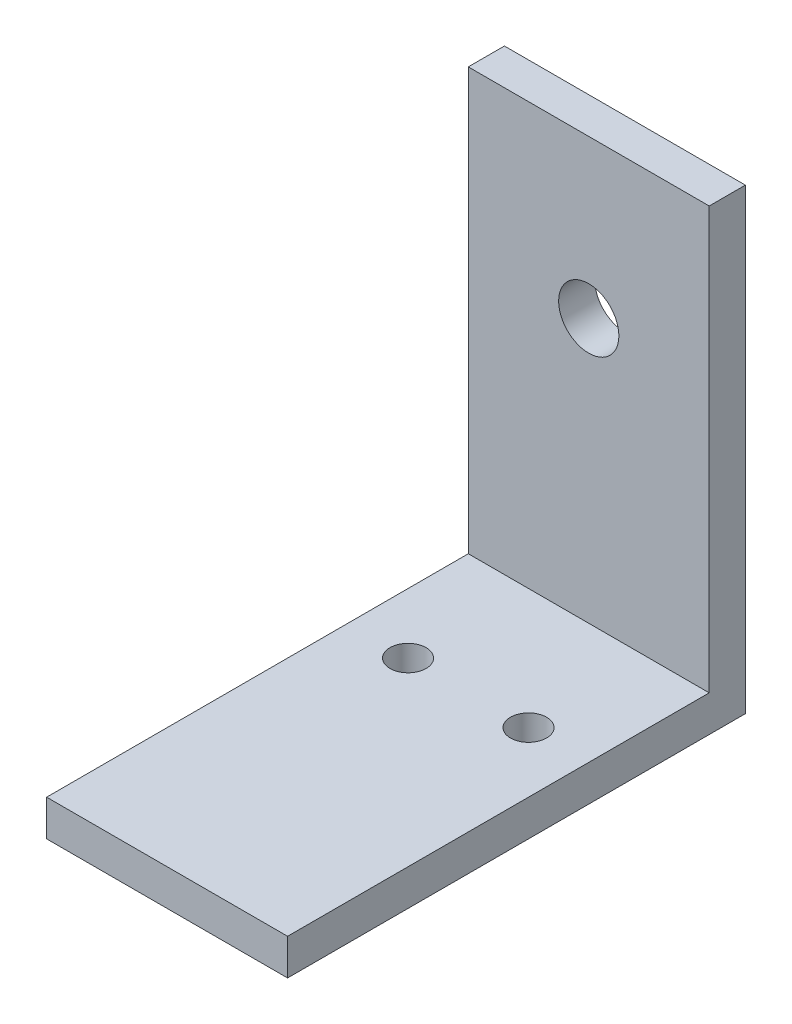
ISO-10303-21;
HEADER;
FILE_DESCRIPTION(('STEP AP214'),'2;1');
FILE_NAME('part.step','',(''),(''),'','','');
FILE_SCHEMA(('AUTOMOTIVE_DESIGN { 1 0 10303 214 1 1 1 1 }'));
ENDSEC;
DATA;
#1=APPLICATION_CONTEXT('core data for automotive mechanical design processes');
#2=APPLICATION_PROTOCOL_DEFINITION('international standard','automotive_design',2000,#1);
#3=PRODUCT_CONTEXT('',#1,'mechanical');
#4=PRODUCT('Part','Part','',(#3));
#5=PRODUCT_RELATED_PRODUCT_CATEGORY('part','',(#4));
#6=PRODUCT_DEFINITION_FORMATION('','',#4);
#7=PRODUCT_DEFINITION_CONTEXT('part definition',#1,'design');
#8=PRODUCT_DEFINITION('design','',#6,#7);
#9=PRODUCT_DEFINITION_SHAPE('','',#8);
#10=(LENGTH_UNIT() NAMED_UNIT(*) SI_UNIT(.MILLI.,.METRE.));
#11=(NAMED_UNIT(*) PLANE_ANGLE_UNIT() SI_UNIT($,.RADIAN.));
#12=(NAMED_UNIT(*) SI_UNIT($,.STERADIAN.) SOLID_ANGLE_UNIT());
#13=UNCERTAINTY_MEASURE_WITH_UNIT(LENGTH_MEASURE(1.E-05),#10,'distance_accuracy_value','');
#14=(GEOMETRIC_REPRESENTATION_CONTEXT(3) GLOBAL_UNCERTAINTY_ASSIGNED_CONTEXT((#13)) GLOBAL_UNIT_ASSIGNED_CONTEXT((#10,
#11,#12)) REPRESENTATION_CONTEXT('',''));
#15=CARTESIAN_POINT('',(0.,0.,0.));
#16=DIRECTION('',(0.,0.,1.));
#17=DIRECTION('',(1.,0.,0.));
#18=AXIS2_PLACEMENT_3D('',#15,#16,#17);
#19=CARTESIAN_POINT('',(10.,19.,3.));
#20=DIRECTION('',(-1.,0.,0.));
#21=DIRECTION('',(0.,-1.,0.));
#22=AXIS2_PLACEMENT_3D('',#19,#20,#21);
#23=PLANE('',#22);
#24=DIRECTION('',(0.,1.,0.));
#25=VECTOR('',#24,1.);
#26=CARTESIAN_POINT('',(10.,19.,0.));
#27=LINE('',#26,#25);
#28=CARTESIAN_POINT('',(10.,-19.,0.));
#29=VERTEX_POINT('',#28);
#30=CARTESIAN_POINT('',(10.,19.,0.));
#31=VERTEX_POINT('',#30);
#32=EDGE_CURVE('E93',#29,#31,#27,.T.);
#33=ORIENTED_EDGE('',*,*,#32,.T.);
#34=DIRECTION('',(0.,0.,-1.));
#35=VECTOR('',#34,1.);
#36=CARTESIAN_POINT('',(10.,19.,3.));
#37=LINE('',#36,#35);
#38=CARTESIAN_POINT('',(10.,19.,3.));
#39=VERTEX_POINT('',#38);
#40=EDGE_CURVE('E11',#39,#31,#37,.T.);
#41=ORIENTED_EDGE('',*,*,#40,.F.);
#42=DIRECTION('',(0.,1.,0.));
#43=VECTOR('',#42,1.);
#44=CARTESIAN_POINT('',(10.,19.,3.));
#45=LINE('',#44,#43);
#46=CARTESIAN_POINT('',(10.,-16.,3.));
#47=VERTEX_POINT('',#46);
#48=EDGE_CURVE('E86',#47,#39,#45,.T.);
#49=ORIENTED_EDGE('',*,*,#48,.F.);
#50=DIRECTION('',(0.,0.,-1.));
#51=VECTOR('',#50,1.);
#52=CARTESIAN_POINT('',(10.,-16.,38.));
#53=LINE('',#52,#51);
#54=CARTESIAN_POINT('',(10.,-16.,38.));
#55=VERTEX_POINT('',#54);
#56=EDGE_CURVE('E101',#55,#47,#53,.T.);
#57=ORIENTED_EDGE('',*,*,#56,.F.);
#58=DIRECTION('',(0.,1.,0.));
#59=VECTOR('',#58,1.);
#60=CARTESIAN_POINT('',(10.,-19.,38.));
#61=LINE('',#60,#59);
#62=CARTESIAN_POINT('',(10.,-19.,38.));
#63=VERTEX_POINT('',#62);
#64=EDGE_CURVE('E96',#63,#55,#61,.T.);
#65=ORIENTED_EDGE('',*,*,#64,.F.);
#66=DIRECTION('',(0.,0.,-1.));
#67=VECTOR('',#66,1.);
#68=CARTESIAN_POINT('',(10.,-19.,3.));
#69=LINE('',#68,#67);
#70=EDGE_CURVE('E79',#63,#29,#69,.T.);
#71=ORIENTED_EDGE('',*,*,#70,.T.);
#72=EDGE_LOOP('',(#33,#41,#49,#57,#65,#71));
#73=FACE_BOUND('',#72,.T.);
#74=ADVANCED_FACE('F34',(#73),#23,.F.);
#75=CARTESIAN_POINT('',(-10.,19.,3.));
#76=DIRECTION('',(0.,-1.,0.));
#77=DIRECTION('',(0.,0.,-1.));
#78=AXIS2_PLACEMENT_3D('',#75,#76,#77);
#79=PLANE('',#78);
#80=DIRECTION('',(-1.,0.,0.));
#81=VECTOR('',#80,1.);
#82=CARTESIAN_POINT('',(-10.,19.,0.));
#83=LINE('',#82,#81);
#84=CARTESIAN_POINT('',(-10.,19.,0.));
#85=VERTEX_POINT('',#84);
#86=EDGE_CURVE('E100',#31,#85,#83,.T.);
#87=ORIENTED_EDGE('',*,*,#86,.T.);
#88=DIRECTION('',(0.,0.,-1.));
#89=VECTOR('',#88,1.);
#90=CARTESIAN_POINT('',(-10.,19.,3.));
#91=LINE('',#90,#89);
#92=CARTESIAN_POINT('',(-10.,19.,3.));
#93=VERTEX_POINT('',#92);
#94=EDGE_CURVE('E41',#93,#85,#91,.T.);
#95=ORIENTED_EDGE('',*,*,#94,.F.);
#96=DIRECTION('',(-1.,0.,0.));
#97=VECTOR('',#96,1.);
#98=CARTESIAN_POINT('',(-10.,19.,3.));
#99=LINE('',#98,#97);
#100=EDGE_CURVE('E54',#39,#93,#99,.T.);
#101=ORIENTED_EDGE('',*,*,#100,.F.);
#102=ORIENTED_EDGE('',*,*,#40,.T.);
#103=EDGE_LOOP('',(#87,#95,#101,#102));
#104=FACE_BOUND('',#103,.T.);
#105=ADVANCED_FACE('F117',(#104),#79,.F.);
#106=CARTESIAN_POINT('',(-10.,19.,3.));
#107=DIRECTION('',(1.,0.,0.));
#108=DIRECTION('',(0.,1.,0.));
#109=AXIS2_PLACEMENT_3D('',#106,#107,#108);
#110=PLANE('',#109);
#111=DIRECTION('',(0.,-1.,0.));
#112=VECTOR('',#111,1.);
#113=CARTESIAN_POINT('',(-10.,19.,0.));
#114=LINE('',#113,#112);
#115=CARTESIAN_POINT('',(-9.99999999999999,-19.,0.));
#116=VERTEX_POINT('',#115);
#117=EDGE_CURVE('E87',#85,#116,#114,.T.);
#118=ORIENTED_EDGE('',*,*,#117,.T.);
#119=DIRECTION('',(0.,0.,-1.));
#120=VECTOR('',#119,1.);
#121=CARTESIAN_POINT('',(-9.99999999999999,-19.,3.));
#122=LINE('',#121,#120);
#123=CARTESIAN_POINT('',(-9.99999999999999,-19.,38.));
#124=VERTEX_POINT('',#123);
#125=EDGE_CURVE('E82',#124,#116,#122,.T.);
#126=ORIENTED_EDGE('',*,*,#125,.F.);
#127=DIRECTION('',(0.,-1.,0.));
#128=VECTOR('',#127,1.);
#129=CARTESIAN_POINT('',(-9.99999999999999,-19.,38.));
#130=LINE('',#129,#128);
#131=CARTESIAN_POINT('',(-9.99999999999999,-16.,38.));
#132=VERTEX_POINT('',#131);
#133=EDGE_CURVE('E137',#132,#124,#130,.T.);
#134=ORIENTED_EDGE('',*,*,#133,.F.);
#135=DIRECTION('',(0.,0.,-1.));
#136=VECTOR('',#135,1.);
#137=CARTESIAN_POINT('',(-9.99999999999999,-16.,38.));
#138=LINE('',#137,#136);
#139=CARTESIAN_POINT('',(-9.99999999999999,-16.,3.));
#140=VERTEX_POINT('',#139);
#141=EDGE_CURVE('E105',#132,#140,#138,.T.);
#142=ORIENTED_EDGE('',*,*,#141,.T.);
#143=DIRECTION('',(0.,-1.,0.));
#144=VECTOR('',#143,1.);
#145=CARTESIAN_POINT('',(-10.,19.,3.));
#146=LINE('',#145,#144);
#147=EDGE_CURVE('E97',#93,#140,#146,.T.);
#148=ORIENTED_EDGE('',*,*,#147,.F.);
#149=ORIENTED_EDGE('',*,*,#94,.T.);
#150=EDGE_LOOP('',(#118,#126,#134,#142,#148,#149));
#151=FACE_BOUND('',#150,.T.);
#152=ADVANCED_FACE('F114',(#151),#110,.F.);
#153=CARTESIAN_POINT('',(-9.99999999999999,-19.,3.));
#154=DIRECTION('',(0.,1.,0.));
#155=DIRECTION('',(0.,0.,1.));
#156=AXIS2_PLACEMENT_3D('',#153,#154,#155);
#157=PLANE('',#156);
#158=CARTESIAN_POINT('',(5.,-19.,13.));
#159=DIRECTION('',(0.,1.,0.));
#160=DIRECTION('',(0.,0.,1.));
#161=AXIS2_PLACEMENT_3D('',#158,#159,#160);
#162=CIRCLE('',#161,1.5);
#163=CARTESIAN_POINT('',(5.,-19.,14.5));
#164=VERTEX_POINT('',#163);
#165=EDGE_CURVE('E158',#164,#164,#162,.T.);
#166=ORIENTED_EDGE('',*,*,#165,.T.);
#167=EDGE_LOOP('',(#166));
#168=FACE_BOUND('',#167,.T.);
#169=CARTESIAN_POINT('',(-4.99999999999999,-19.,13.));
#170=DIRECTION('',(0.,1.,0.));
#171=DIRECTION('',(0.,0.,1.));
#172=AXIS2_PLACEMENT_3D('',#169,#170,#171);
#173=CIRCLE('',#172,1.5);
#174=CARTESIAN_POINT('',(-4.99999999999999,-19.,14.5));
#175=VERTEX_POINT('',#174);
#176=EDGE_CURVE('E152',#175,#175,#173,.T.);
#177=ORIENTED_EDGE('',*,*,#176,.T.);
#178=EDGE_LOOP('',(#177));
#179=FACE_BOUND('',#178,.T.);
#180=DIRECTION('',(1.,0.,0.));
#181=VECTOR('',#180,1.);
#182=CARTESIAN_POINT('',(-9.99999999999999,-19.,0.));
#183=LINE('',#182,#181);
#184=EDGE_CURVE('E74',#116,#29,#183,.T.);
#185=ORIENTED_EDGE('',*,*,#184,.T.);
#186=ORIENTED_EDGE('',*,*,#70,.F.);
#187=DIRECTION('',(1.,0.,0.));
#188=VECTOR('',#187,1.);
#189=CARTESIAN_POINT('',(-9.99999999999999,-19.,38.));
#190=LINE('',#189,#188);
#191=EDGE_CURVE('E133',#124,#63,#190,.T.);
#192=ORIENTED_EDGE('',*,*,#191,.F.);
#193=ORIENTED_EDGE('',*,*,#125,.T.);
#194=EDGE_LOOP('',(#185,#186,#192,#193));
#195=FACE_BOUND('',#194,.T.);
#196=ADVANCED_FACE('F76',(#168,#179,#195),#157,.F.);
#197=CARTESIAN_POINT('',(0.,0.,3.));
#198=DIRECTION('',(0.,0.,1.));
#199=DIRECTION('',(1.,0.,0.));
#200=AXIS2_PLACEMENT_3D('',#197,#198,#199);
#201=PLANE('',#200);
#202=CARTESIAN_POINT('',(0.,5.91599213514371,3.));
#203=DIRECTION('',(0.,0.,1.));
#204=DIRECTION('',(1.,0.,0.));
#205=AXIS2_PLACEMENT_3D('',#202,#203,#204);
#206=CIRCLE('',#205,2.5);
#207=CARTESIAN_POINT('',(2.5,5.91599213514371,3.));
#208=VERTEX_POINT('',#207);
#209=EDGE_CURVE('E138',#208,#208,#206,.T.);
#210=ORIENTED_EDGE('',*,*,#209,.F.);
#211=EDGE_LOOP('',(#210));
#212=FACE_BOUND('',#211,.T.);
#213=DIRECTION('',(-1.,0.,0.));
#214=VECTOR('',#213,1.);
#215=CARTESIAN_POINT('',(-9.99999999999999,-16.,3.));
#216=LINE('',#215,#214);
#217=EDGE_CURVE('E48',#47,#140,#216,.T.);
#218=ORIENTED_EDGE('',*,*,#217,.F.);
#219=ORIENTED_EDGE('',*,*,#48,.T.);
#220=ORIENTED_EDGE('',*,*,#100,.T.);
#221=ORIENTED_EDGE('',*,*,#147,.T.);
#222=EDGE_LOOP('',(#218,#219,#220,#221));
#223=FACE_BOUND('',#222,.T.);
#224=ADVANCED_FACE('F139',(#212,#223),#201,.T.);
#225=CARTESIAN_POINT('',(0.,0.,0.));
#226=DIRECTION('',(0.,0.,1.));
#227=DIRECTION('',(1.,0.,0.));
#228=AXIS2_PLACEMENT_3D('',#225,#226,#227);
#229=PLANE('',#228);
#230=CARTESIAN_POINT('',(0.,5.91599213514371,0.));
#231=DIRECTION('',(0.,0.,-1.));
#232=DIRECTION('',(-1.,0.,0.));
#233=AXIS2_PLACEMENT_3D('',#230,#231,#232);
#234=CIRCLE('',#233,2.5);
#235=CARTESIAN_POINT('',(-2.5,5.91599213514371,0.));
#236=VERTEX_POINT('',#235);
#237=EDGE_CURVE('E149',#236,#236,#234,.T.);
#238=ORIENTED_EDGE('',*,*,#237,.F.);
#239=EDGE_LOOP('',(#238));
#240=FACE_BOUND('',#239,.T.);
#241=ORIENTED_EDGE('',*,*,#32,.F.);
#242=ORIENTED_EDGE('',*,*,#184,.F.);
#243=ORIENTED_EDGE('',*,*,#117,.F.);
#244=ORIENTED_EDGE('',*,*,#86,.F.);
#245=EDGE_LOOP('',(#241,#242,#243,#244));
#246=FACE_BOUND('',#245,.T.);
#247=ADVANCED_FACE('F99',(#240,#246),#229,.F.);
#248=CARTESIAN_POINT('',(-9.99999999999999,-16.,38.));
#249=DIRECTION('',(0.,-1.,0.));
#250=DIRECTION('',(0.,0.,-1.));
#251=AXIS2_PLACEMENT_3D('',#248,#249,#250);
#252=PLANE('',#251);
#253=CARTESIAN_POINT('',(5.,-16.,13.));
#254=DIRECTION('',(0.,1.,0.));
#255=DIRECTION('',(0.,0.,1.));
#256=AXIS2_PLACEMENT_3D('',#253,#254,#255);
#257=CIRCLE('',#256,1.5);
#258=CARTESIAN_POINT('',(5.,-16.,14.5));
#259=VERTEX_POINT('',#258);
#260=EDGE_CURVE('E161',#259,#259,#257,.T.);
#261=ORIENTED_EDGE('',*,*,#260,.F.);
#262=EDGE_LOOP('',(#261));
#263=FACE_BOUND('',#262,.T.);
#264=CARTESIAN_POINT('',(-4.99999999999999,-16.,13.));
#265=DIRECTION('',(0.,1.,0.));
#266=DIRECTION('',(0.,0.,1.));
#267=AXIS2_PLACEMENT_3D('',#264,#265,#266);
#268=CIRCLE('',#267,1.5);
#269=CARTESIAN_POINT('',(-4.99999999999999,-16.,14.5));
#270=VERTEX_POINT('',#269);
#271=EDGE_CURVE('E155',#270,#270,#268,.T.);
#272=ORIENTED_EDGE('',*,*,#271,.F.);
#273=EDGE_LOOP('',(#272));
#274=FACE_BOUND('',#273,.T.);
#275=ORIENTED_EDGE('',*,*,#217,.T.);
#276=ORIENTED_EDGE('',*,*,#141,.F.);
#277=DIRECTION('',(-1.,0.,0.));
#278=VECTOR('',#277,1.);
#279=CARTESIAN_POINT('',(-9.99999999999999,-16.,38.));
#280=LINE('',#279,#278);
#281=EDGE_CURVE('E126',#55,#132,#280,.T.);
#282=ORIENTED_EDGE('',*,*,#281,.F.);
#283=ORIENTED_EDGE('',*,*,#56,.T.);
#284=EDGE_LOOP('',(#275,#276,#282,#283));
#285=FACE_BOUND('',#284,.T.);
#286=ADVANCED_FACE('F122',(#263,#274,#285),#252,.F.);
#287=CARTESIAN_POINT('',(0.,0.,38.));
#288=DIRECTION('',(0.,0.,-1.));
#289=DIRECTION('',(-1.,0.,0.));
#290=AXIS2_PLACEMENT_3D('',#287,#288,#289);
#291=PLANE('',#290);
#292=ORIENTED_EDGE('',*,*,#133,.T.);
#293=ORIENTED_EDGE('',*,*,#191,.T.);
#294=ORIENTED_EDGE('',*,*,#64,.T.);
#295=ORIENTED_EDGE('',*,*,#281,.T.);
#296=EDGE_LOOP('',(#292,#293,#294,#295));
#297=FACE_BOUND('',#296,.T.);
#298=ADVANCED_FACE('F144',(#297),#291,.F.);
#299=CARTESIAN_POINT('',(0.,5.91599213514371,10.));
#300=DIRECTION('',(0.,0.,-1.));
#301=DIRECTION('',(-1.,0.,0.));
#302=AXIS2_PLACEMENT_3D('',#299,#300,#301);
#303=CYLINDRICAL_SURFACE('',#302,2.5);
#304=ORIENTED_EDGE('',*,*,#209,.T.);
#305=EDGE_LOOP('',(#304));
#306=FACE_BOUND('',#305,.T.);
#307=ORIENTED_EDGE('',*,*,#237,.T.);
#308=EDGE_LOOP('',(#307));
#309=FACE_BOUND('',#308,.T.);
#310=ADVANCED_FACE('F176',(#306,#309),#303,.F.);
#311=CARTESIAN_POINT('',(-4.99999999999999,-26.,13.));
#312=DIRECTION('',(0.,1.,0.));
#313=DIRECTION('',(0.,0.,1.));
#314=AXIS2_PLACEMENT_3D('',#311,#312,#313);
#315=CYLINDRICAL_SURFACE('',#314,1.5);
#316=ORIENTED_EDGE('',*,*,#271,.T.);
#317=EDGE_LOOP('',(#316));
#318=FACE_BOUND('',#317,.T.);
#319=ORIENTED_EDGE('',*,*,#176,.F.);
#320=EDGE_LOOP('',(#319));
#321=FACE_BOUND('',#320,.T.);
#322=ADVANCED_FACE('F173',(#318,#321),#315,.F.);
#323=CARTESIAN_POINT('',(5.,-26.,13.));
#324=DIRECTION('',(0.,1.,0.));
#325=DIRECTION('',(0.,0.,1.));
#326=AXIS2_PLACEMENT_3D('',#323,#324,#325);
#327=CYLINDRICAL_SURFACE('',#326,1.5);
#328=ORIENTED_EDGE('',*,*,#260,.T.);
#329=EDGE_LOOP('',(#328));
#330=FACE_BOUND('',#329,.T.);
#331=ORIENTED_EDGE('',*,*,#165,.F.);
#332=EDGE_LOOP('',(#331));
#333=FACE_BOUND('',#332,.T.);
#334=ADVANCED_FACE('F165',(#330,#333),#327,.F.);
#335=CLOSED_SHELL('',(#74,#105,#152,#196,#224,#247,#286,#298,#310,#322,#334));
#336=MANIFOLD_SOLID_BREP('B2',#335);
#337=ADVANCED_BREP_SHAPE_REPRESENTATION('',(#18,#336),#14);
#338=SHAPE_DEFINITION_REPRESENTATION(#9,#337);
ENDSEC;
END-ISO-10303-21;
